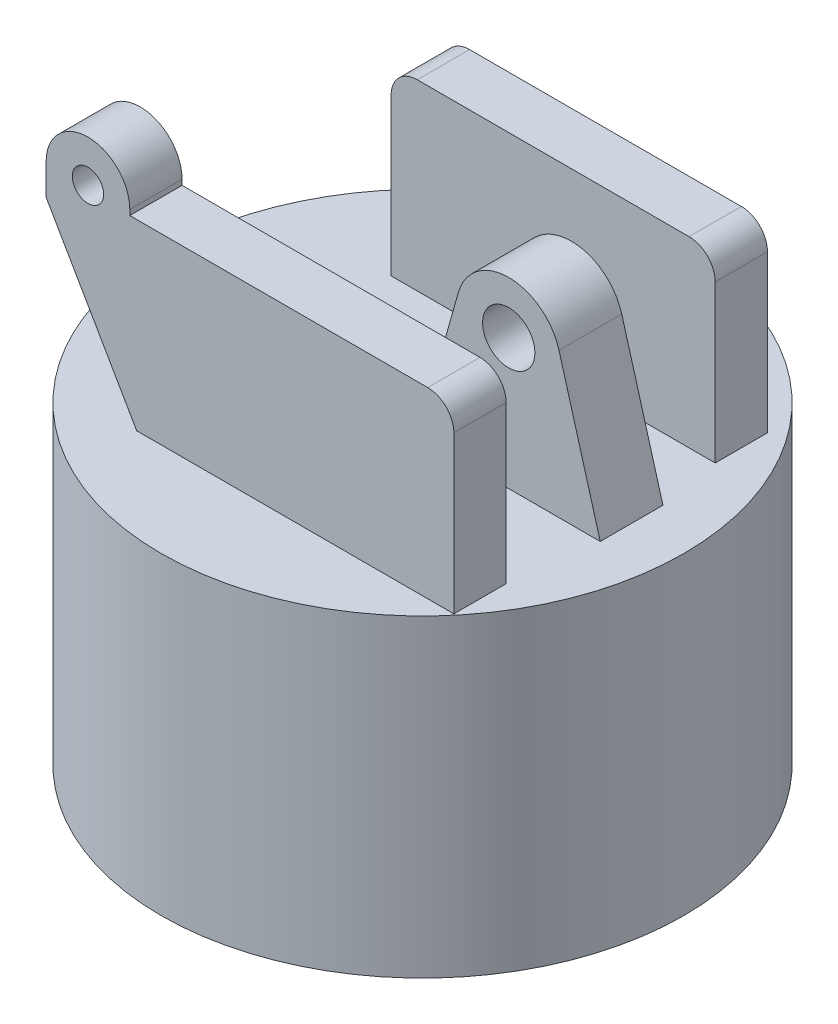
ISO-10303-21;
HEADER;
FILE_DESCRIPTION(('STEP AP214'),'2;1');
FILE_NAME('part.step','',(''),(''),'','','');
FILE_SCHEMA(('AUTOMOTIVE_DESIGN { 1 0 10303 214 1 1 1 1 }'));
ENDSEC;
DATA;
#1=APPLICATION_CONTEXT('core data for automotive mechanical design processes');
#2=APPLICATION_PROTOCOL_DEFINITION('international standard','automotive_design',2000,#1);
#3=PRODUCT_CONTEXT('',#1,'mechanical');
#4=PRODUCT('Part','Part','',(#3));
#5=PRODUCT_RELATED_PRODUCT_CATEGORY('part','',(#4));
#6=PRODUCT_DEFINITION_FORMATION('','',#4);
#7=PRODUCT_DEFINITION_CONTEXT('part definition',#1,'design');
#8=PRODUCT_DEFINITION('design','',#6,#7);
#9=PRODUCT_DEFINITION_SHAPE('','',#8);
#10=(LENGTH_UNIT() NAMED_UNIT(*) SI_UNIT(.MILLI.,.METRE.));
#11=(NAMED_UNIT(*) PLANE_ANGLE_UNIT() SI_UNIT($,.RADIAN.));
#12=(NAMED_UNIT(*) SI_UNIT($,.STERADIAN.) SOLID_ANGLE_UNIT());
#13=UNCERTAINTY_MEASURE_WITH_UNIT(LENGTH_MEASURE(1.E-05),#10,'distance_accuracy_value','');
#14=(GEOMETRIC_REPRESENTATION_CONTEXT(3) GLOBAL_UNCERTAINTY_ASSIGNED_CONTEXT((#13)) GLOBAL_UNIT_ASSIGNED_CONTEXT((#10,
#11,#12)) REPRESENTATION_CONTEXT('',''));
#15=CARTESIAN_POINT('',(0.,0.,0.));
#16=DIRECTION('',(0.,0.,1.));
#17=DIRECTION('',(1.,0.,0.));
#18=AXIS2_PLACEMENT_3D('',#15,#16,#17);
#19=CARTESIAN_POINT('',(0.,60.,0.));
#20=DIRECTION('',(0.,1.,0.));
#21=DIRECTION('',(0.,0.,1.));
#22=AXIS2_PLACEMENT_3D('',#19,#20,#21);
#23=PLANE('',#22);
#24=DIRECTION('',(1.,0.,0.));
#25=VECTOR('',#24,1.);
#26=CARTESIAN_POINT('',(38.,60.,-28.));
#27=LINE('',#26,#25);
#28=CARTESIAN_POINT('',(-24.,60.,-28.));
#29=VERTEX_POINT('',#28);
#30=CARTESIAN_POINT('',(38.,60.,-28.));
#31=VERTEX_POINT('',#30);
#32=EDGE_CURVE('E206',#29,#31,#27,.T.);
#33=ORIENTED_EDGE('',*,*,#32,.T.);
#34=DIRECTION('',(0.,0.,1.));
#35=VECTOR('',#34,1.);
#36=CARTESIAN_POINT('',(38.,60.,-28.));
#37=LINE('',#36,#35);
#38=CARTESIAN_POINT('',(38.,60.,-18.));
#39=VERTEX_POINT('',#38);
#40=EDGE_CURVE('E216',#31,#39,#37,.T.);
#41=ORIENTED_EDGE('',*,*,#40,.T.);
#42=DIRECTION('',(1.,0.,0.));
#43=VECTOR('',#42,1.);
#44=CARTESIAN_POINT('',(38.,60.,-18.));
#45=LINE('',#44,#43);
#46=CARTESIAN_POINT('',(-24.,60.,-18.));
#47=VERTEX_POINT('',#46);
#48=EDGE_CURVE('E201',#47,#39,#45,.T.);
#49=ORIENTED_EDGE('',*,*,#48,.F.);
#50=DIRECTION('',(0.,0.,1.));
#51=VECTOR('',#50,1.);
#52=CARTESIAN_POINT('',(-24.,60.,-28.));
#53=LINE('',#52,#51);
#54=EDGE_CURVE('E208',#29,#47,#53,.T.);
#55=ORIENTED_EDGE('',*,*,#54,.F.);
#56=EDGE_LOOP('',(#33,#41,#49,#55));
#57=FACE_BOUND('',#56,.T.);
#58=CARTESIAN_POINT('',(0.,60.,0.));
#59=DIRECTION('',(0.,1.,0.));
#60=DIRECTION('',(0.,0.,1.));
#61=AXIS2_PLACEMENT_3D('',#58,#59,#60);
#62=CIRCLE('',#61,50.);
#63=CARTESIAN_POINT('',(0.,60.,-50.));
#64=VERTEX_POINT('',#63);
#65=EDGE_CURVE('E277',#64,#64,#62,.T.);
#66=ORIENTED_EDGE('',*,*,#65,.T.);
#67=EDGE_LOOP('',(#66));
#68=FACE_BOUND('',#67,.T.);
#69=DIRECTION('',(1.,0.,0.));
#70=VECTOR('',#69,1.);
#71=CARTESIAN_POINT('',(-22.6794919243112,60.,22.));
#72=LINE('',#71,#70);
#73=CARTESIAN_POINT('',(-22.6794919243112,60.,22.));
#74=VERTEX_POINT('',#73);
#75=CARTESIAN_POINT('',(38.,60.,22.));
#76=VERTEX_POINT('',#75);
#77=EDGE_CURVE('E225',#74,#76,#72,.T.);
#78=ORIENTED_EDGE('',*,*,#77,.T.);
#79=DIRECTION('',(0.,0.,-1.));
#80=VECTOR('',#79,1.);
#81=CARTESIAN_POINT('',(38.,60.,32.));
#82=LINE('',#81,#80);
#83=CARTESIAN_POINT('',(38.,60.,32.));
#84=VERTEX_POINT('',#83);
#85=EDGE_CURVE('E273',#84,#76,#82,.T.);
#86=ORIENTED_EDGE('',*,*,#85,.F.);
#87=DIRECTION('',(1.,0.,0.));
#88=VECTOR('',#87,1.);
#89=CARTESIAN_POINT('',(-22.6794919243112,60.,32.));
#90=LINE('',#89,#88);
#91=CARTESIAN_POINT('',(-22.6794919243112,60.,32.));
#92=VERTEX_POINT('',#91);
#93=EDGE_CURVE('E228',#92,#84,#90,.T.);
#94=ORIENTED_EDGE('',*,*,#93,.F.);
#95=DIRECTION('',(0.,0.,-1.));
#96=VECTOR('',#95,1.);
#97=CARTESIAN_POINT('',(-22.6794919243112,60.,32.));
#98=LINE('',#97,#96);
#99=EDGE_CURVE('E244',#92,#74,#98,.T.);
#100=ORIENTED_EDGE('',*,*,#99,.T.);
#101=EDGE_LOOP('',(#78,#86,#94,#100));
#102=FACE_BOUND('',#101,.T.);
#103=DIRECTION('',(1.,0.,0.));
#104=VECTOR('',#103,1.);
#105=CARTESIAN_POINT('',(4.99999999999999,60.,6.));
#106=LINE('',#105,#104);
#107=CARTESIAN_POINT('',(4.99999999999999,60.,6.));
#108=VERTEX_POINT('',#107);
#109=CARTESIAN_POINT('',(40.,60.,6.));
#110=VERTEX_POINT('',#109);
#111=EDGE_CURVE('E175',#108,#110,#106,.T.);
#112=ORIENTED_EDGE('',*,*,#111,.F.);
#113=DIRECTION('',(0.,0.,-1.));
#114=VECTOR('',#113,1.);
#115=CARTESIAN_POINT('',(4.99999999999999,60.,6.));
#116=LINE('',#115,#114);
#117=CARTESIAN_POINT('',(4.99999999999999,60.,-6.));
#118=VERTEX_POINT('',#117);
#119=EDGE_CURVE('E172',#108,#118,#116,.T.);
#120=ORIENTED_EDGE('',*,*,#119,.T.);
#121=DIRECTION('',(1.,0.,0.));
#122=VECTOR('',#121,1.);
#123=CARTESIAN_POINT('',(4.99999999999999,60.,-6.));
#124=LINE('',#123,#122);
#125=CARTESIAN_POINT('',(40.,60.,-6.));
#126=VERTEX_POINT('',#125);
#127=EDGE_CURVE('E357',#118,#126,#124,.T.);
#128=ORIENTED_EDGE('',*,*,#127,.T.);
#129=DIRECTION('',(0.,0.,-1.));
#130=VECTOR('',#129,1.);
#131=CARTESIAN_POINT('',(40.,60.,6.));
#132=LINE('',#131,#130);
#133=EDGE_CURVE('E193',#110,#126,#132,.T.);
#134=ORIENTED_EDGE('',*,*,#133,.F.);
#135=EDGE_LOOP('',(#112,#120,#128,#134));
#136=FACE_BOUND('',#135,.T.);
#137=ADVANCED_FACE('F41',(#57,#68,#102,#136),#23,.T.);
#138=CARTESIAN_POINT('',(0.,60.,0.));
#139=DIRECTION('',(0.,-1.,0.));
#140=DIRECTION('',(0.,0.,-1.));
#141=AXIS2_PLACEMENT_3D('',#138,#139,#140);
#142=CYLINDRICAL_SURFACE('',#141,50.);
#143=CARTESIAN_POINT('',(0.,0.,0.));
#144=DIRECTION('',(0.,1.,0.));
#145=DIRECTION('',(0.,0.,1.));
#146=AXIS2_PLACEMENT_3D('',#143,#144,#145);
#147=CIRCLE('',#146,50.);
#148=CARTESIAN_POINT('',(0.,0.,-50.));
#149=VERTEX_POINT('',#148);
#150=EDGE_CURVE('E276',#149,#149,#147,.T.);
#151=CARTESIAN_POINT('',(0.,60.,-50.));
#152=CARTESIAN_POINT('',(0.,59.375,-50.));
#153=CARTESIAN_POINT('',(0.,58.75,-50.));
#154=CARTESIAN_POINT('',(0.,57.5,-50.));
#155=CARTESIAN_POINT('',(0.,56.875,-50.));
#156=CARTESIAN_POINT('',(0.,55.625,-50.));
#157=CARTESIAN_POINT('',(0.,55.,-50.));
#158=CARTESIAN_POINT('',(0.,53.75,-50.));
#159=CARTESIAN_POINT('',(0.,53.125,-50.));
#160=CARTESIAN_POINT('',(0.,51.875,-50.));
#161=CARTESIAN_POINT('',(0.,51.25,-50.));
#162=CARTESIAN_POINT('',(0.,50.,-50.));
#163=CARTESIAN_POINT('',(0.,49.375,-50.));
#164=CARTESIAN_POINT('',(0.,48.125,-50.));
#165=CARTESIAN_POINT('',(0.,47.5,-50.));
#166=CARTESIAN_POINT('',(0.,46.25,-50.));
#167=CARTESIAN_POINT('',(0.,45.625,-50.));
#168=CARTESIAN_POINT('',(0.,44.375,-50.));
#169=CARTESIAN_POINT('',(0.,43.75,-50.));
#170=CARTESIAN_POINT('',(0.,42.5,-50.));
#171=CARTESIAN_POINT('',(0.,41.875,-50.));
#172=CARTESIAN_POINT('',(0.,40.625,-50.));
#173=CARTESIAN_POINT('',(0.,40.,-50.));
#174=CARTESIAN_POINT('',(0.,38.75,-50.));
#175=CARTESIAN_POINT('',(0.,38.125,-50.));
#176=CARTESIAN_POINT('',(0.,36.875,-50.));
#177=CARTESIAN_POINT('',(0.,36.25,-50.));
#178=CARTESIAN_POINT('',(0.,35.,-50.));
#179=CARTESIAN_POINT('',(0.,34.375,-50.));
#180=CARTESIAN_POINT('',(0.,33.125,-50.));
#181=CARTESIAN_POINT('',(0.,32.5,-50.));
#182=CARTESIAN_POINT('',(0.,31.25,-50.));
#183=CARTESIAN_POINT('',(0.,30.625,-50.));
#184=CARTESIAN_POINT('',(0.,29.375,-50.));
#185=CARTESIAN_POINT('',(0.,28.75,-50.));
#186=CARTESIAN_POINT('',(0.,27.5,-50.));
#187=CARTESIAN_POINT('',(0.,26.875,-50.));
#188=CARTESIAN_POINT('',(0.,25.625,-50.));
#189=CARTESIAN_POINT('',(0.,25.,-50.));
#190=CARTESIAN_POINT('',(0.,23.75,-50.));
#191=CARTESIAN_POINT('',(0.,23.125,-50.));
#192=CARTESIAN_POINT('',(0.,21.875,-50.));
#193=CARTESIAN_POINT('',(0.,21.25,-50.));
#194=CARTESIAN_POINT('',(0.,20.,-50.));
#195=CARTESIAN_POINT('',(0.,19.375,-50.));
#196=CARTESIAN_POINT('',(0.,18.125,-50.));
#197=CARTESIAN_POINT('',(0.,17.5,-50.));
#198=CARTESIAN_POINT('',(0.,16.25,-50.));
#199=CARTESIAN_POINT('',(0.,15.625,-50.));
#200=CARTESIAN_POINT('',(0.,14.375,-50.));
#201=CARTESIAN_POINT('',(0.,13.75,-50.));
#202=CARTESIAN_POINT('',(0.,12.5,-50.));
#203=CARTESIAN_POINT('',(0.,11.875,-50.));
#204=CARTESIAN_POINT('',(0.,10.625,-50.));
#205=CARTESIAN_POINT('',(0.,10.,-50.));
#206=CARTESIAN_POINT('',(0.,8.75,-50.));
#207=CARTESIAN_POINT('',(0.,8.125,-50.));
#208=CARTESIAN_POINT('',(0.,6.875,-50.));
#209=CARTESIAN_POINT('',(0.,6.25,-50.));
#210=CARTESIAN_POINT('',(0.,5.,-50.));
#211=CARTESIAN_POINT('',(0.,4.375,-50.));
#212=CARTESIAN_POINT('',(0.,3.125,-50.));
#213=CARTESIAN_POINT('',(0.,2.5,-50.));
#214=CARTESIAN_POINT('',(0.,1.25,-50.));
#215=CARTESIAN_POINT('',(0.,0.625000000000001,-50.));
#216=CARTESIAN_POINT('',(0.,0.,-50.));
#217=B_SPLINE_CURVE_WITH_KNOTS('',3,(#151,#152,#153,#154,#155,#156,#157,#158,#159,#160,#161,
#162,#163,#164,#165,#166,#167,#168,#169,#170,#171,#172,#173,#174,#175,#176,#177,#178,#179,#180,
#181,#182,#183,#184,#185,#186,#187,#188,#189,#190,#191,#192,#193,#194,#195,#196,#197,#198,#199,
#200,#201,#202,#203,#204,#205,#206,#207,#208,#209,#210,#211,#212,#213,#214,#215,#216),
.UNSPECIFIED.,.F.,.F.,(4,2,2,2,2,2,2,2,2,2,2,2,2,2,2,2,2,2,2,2,2,2,2,2,2,2,2,2,2,2,2,2,4),(0.,
1.875,3.75,5.62500000000001,7.50000000000001,9.375,11.25,13.125,15.,16.875,18.75,20.625,22.5,
24.375,26.25,28.125,30.,31.875,33.75,35.625,37.5,39.375,41.25,43.125,45.,46.875,48.75,50.625,
52.5,54.375,56.25,58.125,60.),.UNSPECIFIED.);
#218=EDGE_CURVE('BSEAM344',#64,#149,#217,.T.);
#219=ORIENTED_EDGE('',*,*,#65,.F.);
#220=ORIENTED_EDGE('',*,*,#150,.T.);
#221=ORIENTED_EDGE('',*,*,#218,.T.);
#222=ORIENTED_EDGE('',*,*,#218,.F.);
#223=EDGE_LOOP('',(#219,#221,#220,#222));
#224=FACE_BOUND('',#223,.T.);
#225=ADVANCED_FACE('F344',(#224),#142,.T.);
#226=CARTESIAN_POINT('',(0.,0.,0.));
#227=DIRECTION('',(0.,1.,0.));
#228=DIRECTION('',(0.,0.,1.));
#229=AXIS2_PLACEMENT_3D('',#226,#227,#228);
#230=PLANE('',#229);
#231=ORIENTED_EDGE('',*,*,#150,.F.);
#232=EDGE_LOOP('',(#231));
#233=FACE_BOUND('',#232,.T.);
#234=ADVANCED_FACE('F419',(#233),#230,.F.);
#235=CARTESIAN_POINT('',(-32.,96.,32.));
#236=DIRECTION('',(0.,0.,1.));
#237=DIRECTION('',(1.,0.,0.));
#238=AXIS2_PLACEMENT_3D('',#235,#236,#237);
#239=PLANE('',#238);
#240=DIRECTION('',(0.,1.,0.));
#241=VECTOR('',#240,1.);
#242=CARTESIAN_POINT('',(38.,60.,32.));
#243=LINE('',#242,#241);
#244=CARTESIAN_POINT('',(38.,90.,32.));
#245=VERTEX_POINT('',#244);
#246=EDGE_CURVE('E231',#84,#245,#243,.T.);
#247=ORIENTED_EDGE('',*,*,#246,.T.);
#248=CARTESIAN_POINT('',(33.,90.,32.));
#249=DIRECTION('',(0.,0.,1.));
#250=DIRECTION('',(1.,0.,0.));
#251=AXIS2_PLACEMENT_3D('',#248,#249,#250);
#252=CIRCLE('',#251,5.);
#253=CARTESIAN_POINT('',(33.,95.,32.));
#254=VERTEX_POINT('',#253);
#255=EDGE_CURVE('E11',#245,#254,#252,.T.);
#256=ORIENTED_EDGE('',*,*,#255,.T.);
#257=DIRECTION('',(-1.,0.,0.));
#258=VECTOR('',#257,1.);
#259=CARTESIAN_POINT('',(38.,95.,32.));
#260=LINE('',#259,#258);
#261=CARTESIAN_POINT('',(-24.,95.,32.));
#262=VERTEX_POINT('',#261);
#263=EDGE_CURVE('E234',#254,#262,#260,.T.);
#264=ORIENTED_EDGE('',*,*,#263,.T.);
#265=DIRECTION('',(0.,1.,0.));
#266=VECTOR('',#265,1.);
#267=CARTESIAN_POINT('',(-24.,95.,32.));
#268=LINE('',#267,#266);
#269=CARTESIAN_POINT('',(-24.,96.,32.));
#270=VERTEX_POINT('',#269);
#271=EDGE_CURVE('E236',#262,#270,#268,.T.);
#272=ORIENTED_EDGE('',*,*,#271,.T.);
#273=CARTESIAN_POINT('',(-32.,96.,32.));
#274=DIRECTION('',(0.,0.,1.));
#275=DIRECTION('',(1.,0.,0.));
#276=AXIS2_PLACEMENT_3D('',#273,#274,#275);
#277=CIRCLE('',#276,8.);
#278=CARTESIAN_POINT('',(-40.,96.,32.));
#279=VERTEX_POINT('',#278);
#280=EDGE_CURVE('E238',#270,#279,#277,.T.);
#281=ORIENTED_EDGE('',*,*,#280,.T.);
#282=DIRECTION('',(0.,-1.,0.));
#283=VECTOR('',#282,1.);
#284=CARTESIAN_POINT('',(-40.,96.,32.));
#285=LINE('',#284,#283);
#286=CARTESIAN_POINT('',(-40.,90.,32.));
#287=VERTEX_POINT('',#286);
#288=EDGE_CURVE('E240',#279,#287,#285,.T.);
#289=ORIENTED_EDGE('',*,*,#288,.T.);
#290=DIRECTION('',(0.500000000000002,-0.866025403784437,0.));
#291=VECTOR('',#290,1.);
#292=CARTESIAN_POINT('',(-40.,90.,32.));
#293=LINE('',#292,#291);
#294=EDGE_CURVE('E242',#287,#92,#293,.T.);
#295=ORIENTED_EDGE('',*,*,#294,.T.);
#296=ORIENTED_EDGE('',*,*,#93,.T.);
#297=EDGE_LOOP('',(#247,#256,#264,#272,#281,#289,#295,#296));
#298=FACE_BOUND('',#297,.T.);
#299=CARTESIAN_POINT('',(-32.,96.,32.));
#300=DIRECTION('',(0.,0.,1.));
#301=DIRECTION('',(1.,0.,0.));
#302=AXIS2_PLACEMENT_3D('',#299,#300,#301);
#303=CIRCLE('',#302,3.);
#304=CARTESIAN_POINT('',(-29.,96.,32.));
#305=VERTEX_POINT('',#304);
#306=EDGE_CURVE('E222',#305,#305,#303,.T.);
#307=ORIENTED_EDGE('',*,*,#306,.F.);
#308=EDGE_LOOP('',(#307));
#309=FACE_BOUND('',#308,.T.);
#310=ADVANCED_FACE('F316',(#298,#309),#239,.T.);
#311=CARTESIAN_POINT('',(-32.,96.,22.));
#312=DIRECTION('',(0.,0.,1.));
#313=DIRECTION('',(1.,0.,0.));
#314=AXIS2_PLACEMENT_3D('',#311,#312,#313);
#315=PLANE('',#314);
#316=DIRECTION('',(-1.,0.,0.));
#317=VECTOR('',#316,1.);
#318=CARTESIAN_POINT('',(38.,95.,22.));
#319=LINE('',#318,#317);
#320=CARTESIAN_POINT('',(33.,95.,22.));
#321=VERTEX_POINT('',#320);
#322=CARTESIAN_POINT('',(-24.,95.,22.));
#323=VERTEX_POINT('',#322);
#324=EDGE_CURVE('E249',#321,#323,#319,.T.);
#325=ORIENTED_EDGE('',*,*,#324,.F.);
#326=CARTESIAN_POINT('',(33.,90.,22.));
#327=DIRECTION('',(0.,0.,1.));
#328=DIRECTION('',(1.,0.,0.));
#329=AXIS2_PLACEMENT_3D('',#326,#327,#328);
#330=CIRCLE('',#329,5.);
#331=CARTESIAN_POINT('',(38.,90.,22.));
#332=VERTEX_POINT('',#331);
#333=EDGE_CURVE('E303',#321,#332,#330,.F.);
#334=ORIENTED_EDGE('',*,*,#333,.T.);
#335=DIRECTION('',(0.,1.,0.));
#336=VECTOR('',#335,1.);
#337=CARTESIAN_POINT('',(38.,60.,22.));
#338=LINE('',#337,#336);
#339=EDGE_CURVE('E247',#76,#332,#338,.T.);
#340=ORIENTED_EDGE('',*,*,#339,.F.);
#341=ORIENTED_EDGE('',*,*,#77,.F.);
#342=DIRECTION('',(0.500000000000002,-0.866025403784437,0.));
#343=VECTOR('',#342,1.);
#344=CARTESIAN_POINT('',(-40.,90.,22.));
#345=LINE('',#344,#343);
#346=CARTESIAN_POINT('',(-40.,90.,22.));
#347=VERTEX_POINT('',#346);
#348=EDGE_CURVE('E232',#347,#74,#345,.T.);
#349=ORIENTED_EDGE('',*,*,#348,.F.);
#350=DIRECTION('',(0.,-1.,0.));
#351=VECTOR('',#350,1.);
#352=CARTESIAN_POINT('',(-40.,96.,22.));
#353=LINE('',#352,#351);
#354=CARTESIAN_POINT('',(-40.,96.,22.));
#355=VERTEX_POINT('',#354);
#356=EDGE_CURVE('E255',#355,#347,#353,.T.);
#357=ORIENTED_EDGE('',*,*,#356,.F.);
#358=CARTESIAN_POINT('',(-32.,96.,22.));
#359=DIRECTION('',(0.,0.,1.));
#360=DIRECTION('',(1.,0.,0.));
#361=AXIS2_PLACEMENT_3D('',#358,#359,#360);
#362=CIRCLE('',#361,8.);
#363=CARTESIAN_POINT('',(-24.,96.,22.));
#364=VERTEX_POINT('',#363);
#365=EDGE_CURVE('E253',#364,#355,#362,.T.);
#366=ORIENTED_EDGE('',*,*,#365,.F.);
#367=DIRECTION('',(0.,1.,0.));
#368=VECTOR('',#367,1.);
#369=CARTESIAN_POINT('',(-24.,95.,22.));
#370=LINE('',#369,#368);
#371=EDGE_CURVE('E251',#323,#364,#370,.T.);
#372=ORIENTED_EDGE('',*,*,#371,.F.);
#373=EDGE_LOOP('',(#325,#334,#340,#341,#349,#357,#366,#372));
#374=FACE_BOUND('',#373,.T.);
#375=CARTESIAN_POINT('',(-32.,96.,22.));
#376=DIRECTION('',(0.,0.,1.));
#377=DIRECTION('',(1.,0.,0.));
#378=AXIS2_PLACEMENT_3D('',#375,#376,#377);
#379=CIRCLE('',#378,3.);
#380=CARTESIAN_POINT('',(-29.,96.,22.));
#381=VERTEX_POINT('',#380);
#382=EDGE_CURVE('E219',#381,#381,#379,.T.);
#383=ORIENTED_EDGE('',*,*,#382,.T.);
#384=EDGE_LOOP('',(#383));
#385=FACE_BOUND('',#384,.T.);
#386=ADVANCED_FACE('F306',(#374,#385),#315,.F.);
#387=CARTESIAN_POINT('',(38.,60.,32.));
#388=DIRECTION('',(-1.,0.,0.));
#389=DIRECTION('',(0.,-1.,0.));
#390=AXIS2_PLACEMENT_3D('',#387,#388,#389);
#391=PLANE('',#390);
#392=ORIENTED_EDGE('',*,*,#339,.T.);
#393=DIRECTION('',(0.,0.,-1.));
#394=VECTOR('',#393,1.);
#395=CARTESIAN_POINT('',(38.,90.,32.));
#396=LINE('',#395,#394);
#397=EDGE_CURVE('E49',#332,#245,#396,.F.);
#398=ORIENTED_EDGE('',*,*,#397,.T.);
#399=ORIENTED_EDGE('',*,*,#246,.F.);
#400=ORIENTED_EDGE('',*,*,#85,.T.);
#401=EDGE_LOOP('',(#392,#398,#399,#400));
#402=FACE_BOUND('',#401,.T.);
#403=ADVANCED_FACE('F311',(#402),#391,.F.);
#404=CARTESIAN_POINT('',(38.,95.,32.));
#405=DIRECTION('',(0.,-1.,0.));
#406=DIRECTION('',(1.,0.,0.));
#407=AXIS2_PLACEMENT_3D('',#404,#405,#406);
#408=PLANE('',#407);
#409=ORIENTED_EDGE('',*,*,#263,.F.);
#410=DIRECTION('',(0.,0.,-1.));
#411=VECTOR('',#410,1.);
#412=CARTESIAN_POINT('',(33.,95.,32.));
#413=LINE('',#412,#411);
#414=EDGE_CURVE('E300',#254,#321,#413,.T.);
#415=ORIENTED_EDGE('',*,*,#414,.T.);
#416=ORIENTED_EDGE('',*,*,#324,.T.);
#417=DIRECTION('',(0.,0.,-1.));
#418=VECTOR('',#417,1.);
#419=CARTESIAN_POINT('',(-24.,95.,32.));
#420=LINE('',#419,#418);
#421=EDGE_CURVE('E270',#262,#323,#420,.T.);
#422=ORIENTED_EDGE('',*,*,#421,.F.);
#423=EDGE_LOOP('',(#409,#415,#416,#422));
#424=FACE_BOUND('',#423,.T.);
#425=ADVANCED_FACE('F320',(#424),#408,.F.);
#426=CARTESIAN_POINT('',(-24.,95.,32.));
#427=DIRECTION('',(-1.,0.,0.));
#428=DIRECTION('',(0.,0.,1.));
#429=AXIS2_PLACEMENT_3D('',#426,#427,#428);
#430=PLANE('',#429);
#431=ORIENTED_EDGE('',*,*,#371,.T.);
#432=DIRECTION('',(0.,0.,-1.));
#433=VECTOR('',#432,1.);
#434=CARTESIAN_POINT('',(-24.,96.,32.));
#435=LINE('',#434,#433);
#436=EDGE_CURVE('E267',#270,#364,#435,.T.);
#437=ORIENTED_EDGE('',*,*,#436,.F.);
#438=ORIENTED_EDGE('',*,*,#271,.F.);
#439=ORIENTED_EDGE('',*,*,#421,.T.);
#440=EDGE_LOOP('',(#431,#437,#438,#439));
#441=FACE_BOUND('',#440,.T.);
#442=ADVANCED_FACE('F324',(#441),#430,.F.);
#443=CARTESIAN_POINT('',(-32.,96.,32.));
#444=DIRECTION('',(0.,0.,-1.));
#445=DIRECTION('',(-1.,0.,0.));
#446=AXIS2_PLACEMENT_3D('',#443,#444,#445);
#447=CYLINDRICAL_SURFACE('',#446,8.);
#448=ORIENTED_EDGE('',*,*,#365,.T.);
#449=DIRECTION('',(0.,0.,-1.));
#450=VECTOR('',#449,1.);
#451=CARTESIAN_POINT('',(-40.,96.,32.));
#452=LINE('',#451,#450);
#453=EDGE_CURVE('E264',#279,#355,#452,.T.);
#454=ORIENTED_EDGE('',*,*,#453,.F.);
#455=ORIENTED_EDGE('',*,*,#280,.F.);
#456=ORIENTED_EDGE('',*,*,#436,.T.);
#457=EDGE_LOOP('',(#448,#454,#455,#456));
#458=FACE_BOUND('',#457,.T.);
#459=ADVANCED_FACE('F330',(#458),#447,.T.);
#460=CARTESIAN_POINT('',(-40.,96.,32.));
#461=DIRECTION('',(1.,0.,0.));
#462=DIRECTION('',(0.,0.,-1.));
#463=AXIS2_PLACEMENT_3D('',#460,#461,#462);
#464=PLANE('',#463);
#465=ORIENTED_EDGE('',*,*,#356,.T.);
#466=DIRECTION('',(0.,0.,-1.));
#467=VECTOR('',#466,1.);
#468=CARTESIAN_POINT('',(-40.,90.,32.));
#469=LINE('',#468,#467);
#470=EDGE_CURVE('E261',#287,#347,#469,.T.);
#471=ORIENTED_EDGE('',*,*,#470,.F.);
#472=ORIENTED_EDGE('',*,*,#288,.F.);
#473=ORIENTED_EDGE('',*,*,#453,.T.);
#474=EDGE_LOOP('',(#465,#471,#472,#473));
#475=FACE_BOUND('',#474,.T.);
#476=ADVANCED_FACE('F334',(#475),#464,.F.);
#477=CARTESIAN_POINT('',(-40.,90.,32.));
#478=DIRECTION('',(0.866025403784438,0.500000000000002,0.));
#479=DIRECTION('',(-0.500000000000002,0.866025403784438,0.));
#480=AXIS2_PLACEMENT_3D('',#477,#478,#479);
#481=PLANE('',#480);
#482=ORIENTED_EDGE('',*,*,#348,.T.);
#483=ORIENTED_EDGE('',*,*,#99,.F.);
#484=ORIENTED_EDGE('',*,*,#294,.F.);
#485=ORIENTED_EDGE('',*,*,#470,.T.);
#486=EDGE_LOOP('',(#482,#483,#484,#485));
#487=FACE_BOUND('',#486,.T.);
#488=ADVANCED_FACE('F339',(#487),#481,.F.);
#489=CARTESIAN_POINT('',(-32.,96.,32.));
#490=DIRECTION('',(0.,0.,-1.));
#491=DIRECTION('',(-1.,0.,0.));
#492=AXIS2_PLACEMENT_3D('',#489,#490,#491);
#493=CYLINDRICAL_SURFACE('',#492,3.);
#494=ORIENTED_EDGE('',*,*,#306,.T.);
#495=EDGE_LOOP('',(#494));
#496=FACE_BOUND('',#495,.T.);
#497=ORIENTED_EDGE('',*,*,#382,.F.);
#498=EDGE_LOOP('',(#497));
#499=FACE_BOUND('',#498,.T.);
#500=ADVANCED_FACE('F412',(#496,#499),#493,.F.);
#501=CARTESIAN_POINT('',(38.,95.,-28.));
#502=DIRECTION('',(1.,0.,0.));
#503=DIRECTION('',(0.,1.,0.));
#504=AXIS2_PLACEMENT_3D('',#501,#502,#503);
#505=PLANE('',#504);
#506=DIRECTION('',(0.,1.,0.));
#507=VECTOR('',#506,1.);
#508=CARTESIAN_POINT('',(38.,95.,-28.));
#509=LINE('',#508,#507);
#510=CARTESIAN_POINT('',(38.,90.,-28.));
#511=VERTEX_POINT('',#510);
#512=EDGE_CURVE('E197',#31,#511,#509,.T.);
#513=ORIENTED_EDGE('',*,*,#512,.T.);
#514=DIRECTION('',(0.,0.,1.));
#515=VECTOR('',#514,1.);
#516=CARTESIAN_POINT('',(38.,90.,-28.));
#517=LINE('',#516,#515);
#518=CARTESIAN_POINT('',(38.,90.,-18.));
#519=VERTEX_POINT('',#518);
#520=EDGE_CURVE('E297',#511,#519,#517,.T.);
#521=ORIENTED_EDGE('',*,*,#520,.T.);
#522=DIRECTION('',(0.,1.,0.));
#523=VECTOR('',#522,1.);
#524=CARTESIAN_POINT('',(38.,95.,-18.));
#525=LINE('',#524,#523);
#526=EDGE_CURVE('E188',#39,#519,#525,.T.);
#527=ORIENTED_EDGE('',*,*,#526,.F.);
#528=ORIENTED_EDGE('',*,*,#40,.F.);
#529=EDGE_LOOP('',(#513,#521,#527,#528));
#530=FACE_BOUND('',#529,.T.);
#531=ADVANCED_FACE('F405',(#530),#505,.T.);
#532=CARTESIAN_POINT('',(-24.,95.,-28.));
#533=DIRECTION('',(-1.,0.,0.));
#534=DIRECTION('',(0.,-1.,0.));
#535=AXIS2_PLACEMENT_3D('',#532,#533,#534);
#536=PLANE('',#535);
#537=DIRECTION('',(0.,-1.,0.));
#538=VECTOR('',#537,1.);
#539=CARTESIAN_POINT('',(-24.,95.,-18.));
#540=LINE('',#539,#538);
#541=CARTESIAN_POINT('',(-24.,90.,-18.));
#542=VERTEX_POINT('',#541);
#543=EDGE_CURVE('E212',#542,#47,#540,.T.);
#544=ORIENTED_EDGE('',*,*,#543,.F.);
#545=DIRECTION('',(0.,0.,1.));
#546=VECTOR('',#545,1.);
#547=CARTESIAN_POINT('',(-24.,90.,-28.));
#548=LINE('',#547,#546);
#549=CARTESIAN_POINT('',(-24.,90.,-28.));
#550=VERTEX_POINT('',#549);
#551=EDGE_CURVE('E291',#542,#550,#548,.F.);
#552=ORIENTED_EDGE('',*,*,#551,.T.);
#553=DIRECTION('',(0.,-1.,0.));
#554=VECTOR('',#553,1.);
#555=CARTESIAN_POINT('',(-24.,95.,-28.));
#556=LINE('',#555,#554);
#557=EDGE_CURVE('E204',#550,#29,#556,.T.);
#558=ORIENTED_EDGE('',*,*,#557,.T.);
#559=ORIENTED_EDGE('',*,*,#54,.T.);
#560=EDGE_LOOP('',(#544,#552,#558,#559));
#561=FACE_BOUND('',#560,.T.);
#562=ADVANCED_FACE('F402',(#561),#536,.T.);
#563=CARTESIAN_POINT('',(38.,95.,-28.));
#564=DIRECTION('',(0.,1.,0.));
#565=DIRECTION('',(-1.,0.,0.));
#566=AXIS2_PLACEMENT_3D('',#563,#564,#565);
#567=PLANE('',#566);
#568=DIRECTION('',(-1.,0.,0.));
#569=VECTOR('',#568,1.);
#570=CARTESIAN_POINT('',(38.,95.,-28.));
#571=LINE('',#570,#569);
#572=CARTESIAN_POINT('',(33.,95.,-28.));
#573=VERTEX_POINT('',#572);
#574=CARTESIAN_POINT('',(-19.,95.,-28.));
#575=VERTEX_POINT('',#574);
#576=EDGE_CURVE('E200',#573,#575,#571,.T.);
#577=ORIENTED_EDGE('',*,*,#576,.T.);
#578=DIRECTION('',(0.,0.,1.));
#579=VECTOR('',#578,1.);
#580=CARTESIAN_POINT('',(-19.,95.,-28.));
#581=LINE('',#580,#579);
#582=CARTESIAN_POINT('',(-19.,95.,-18.));
#583=VERTEX_POINT('',#582);
#584=EDGE_CURVE('E284',#575,#583,#581,.T.);
#585=ORIENTED_EDGE('',*,*,#584,.T.);
#586=DIRECTION('',(-1.,0.,0.));
#587=VECTOR('',#586,1.);
#588=CARTESIAN_POINT('',(38.,95.,-18.));
#589=LINE('',#588,#587);
#590=CARTESIAN_POINT('',(33.,95.,-18.));
#591=VERTEX_POINT('',#590);
#592=EDGE_CURVE('E191',#591,#583,#589,.T.);
#593=ORIENTED_EDGE('',*,*,#592,.F.);
#594=DIRECTION('',(0.,0.,1.));
#595=VECTOR('',#594,1.);
#596=CARTESIAN_POINT('',(33.,95.,-28.));
#597=LINE('',#596,#595);
#598=EDGE_CURVE('E280',#591,#573,#597,.F.);
#599=ORIENTED_EDGE('',*,*,#598,.T.);
#600=EDGE_LOOP('',(#577,#585,#593,#599));
#601=FACE_BOUND('',#600,.T.);
#602=ADVANCED_FACE('F396',(#601),#567,.T.);
#603=CARTESIAN_POINT('',(0.,0.,-28.));
#604=DIRECTION('',(0.,0.,-1.));
#605=DIRECTION('',(-1.,0.,0.));
#606=AXIS2_PLACEMENT_3D('',#603,#604,#605);
#607=PLANE('',#606);
#608=ORIENTED_EDGE('',*,*,#557,.F.);
#609=CARTESIAN_POINT('',(-19.,90.,-28.));
#610=DIRECTION('',(0.,0.,-1.));
#611=DIRECTION('',(-1.,0.,0.));
#612=AXIS2_PLACEMENT_3D('',#609,#610,#611);
#613=CIRCLE('',#612,5.);
#614=EDGE_CURVE('E295',#550,#575,#613,.T.);
#615=ORIENTED_EDGE('',*,*,#614,.T.);
#616=ORIENTED_EDGE('',*,*,#576,.F.);
#617=CARTESIAN_POINT('',(33.,90.,-28.));
#618=DIRECTION('',(0.,0.,-1.));
#619=DIRECTION('',(-1.,0.,0.));
#620=AXIS2_PLACEMENT_3D('',#617,#618,#619);
#621=CIRCLE('',#620,5.);
#622=EDGE_CURVE('E293',#573,#511,#621,.T.);
#623=ORIENTED_EDGE('',*,*,#622,.T.);
#624=ORIENTED_EDGE('',*,*,#512,.F.);
#625=ORIENTED_EDGE('',*,*,#32,.F.);
#626=EDGE_LOOP('',(#608,#615,#616,#623,#624,#625));
#627=FACE_BOUND('',#626,.T.);
#628=ADVANCED_FACE('F392',(#627),#607,.T.);
#629=CARTESIAN_POINT('',(0.,0.,-18.));
#630=DIRECTION('',(0.,0.,-1.));
#631=DIRECTION('',(-1.,0.,0.));
#632=AXIS2_PLACEMENT_3D('',#629,#630,#631);
#633=PLANE('',#632);
#634=ORIENTED_EDGE('',*,*,#592,.T.);
#635=CARTESIAN_POINT('',(-19.,90.,-18.));
#636=DIRECTION('',(0.,0.,-1.));
#637=DIRECTION('',(-1.,0.,0.));
#638=AXIS2_PLACEMENT_3D('',#635,#636,#637);
#639=CIRCLE('',#638,5.);
#640=EDGE_CURVE('E289',#583,#542,#639,.F.);
#641=ORIENTED_EDGE('',*,*,#640,.T.);
#642=ORIENTED_EDGE('',*,*,#543,.T.);
#643=ORIENTED_EDGE('',*,*,#48,.T.);
#644=ORIENTED_EDGE('',*,*,#526,.T.);
#645=CARTESIAN_POINT('',(33.,90.,-18.));
#646=DIRECTION('',(0.,0.,-1.));
#647=DIRECTION('',(-1.,0.,0.));
#648=AXIS2_PLACEMENT_3D('',#645,#646,#647);
#649=CIRCLE('',#648,5.);
#650=EDGE_CURVE('E287',#519,#591,#649,.F.);
#651=ORIENTED_EDGE('',*,*,#650,.T.);
#652=EDGE_LOOP('',(#634,#641,#642,#643,#644,#651));
#653=FACE_BOUND('',#652,.T.);
#654=ADVANCED_FACE('F395',(#653),#633,.F.);
#655=CARTESIAN_POINT('',(-19.,90.,-28.));
#656=DIRECTION('',(0.,0.,1.));
#657=DIRECTION('',(1.,0.,0.));
#658=AXIS2_PLACEMENT_3D('',#655,#656,#657);
#659=CYLINDRICAL_SURFACE('',#658,5.);
#660=ORIENTED_EDGE('',*,*,#614,.F.);
#661=ORIENTED_EDGE('',*,*,#551,.F.);
#662=ORIENTED_EDGE('',*,*,#640,.F.);
#663=ORIENTED_EDGE('',*,*,#584,.F.);
#664=EDGE_LOOP('',(#660,#661,#662,#663));
#665=FACE_BOUND('',#664,.T.);
#666=ADVANCED_FACE('F400',(#665),#659,.T.);
#667=CARTESIAN_POINT('',(33.,90.,-28.));
#668=DIRECTION('',(0.,0.,1.));
#669=DIRECTION('',(1.,0.,0.));
#670=AXIS2_PLACEMENT_3D('',#667,#668,#669);
#671=CYLINDRICAL_SURFACE('',#670,5.);
#672=ORIENTED_EDGE('',*,*,#622,.F.);
#673=ORIENTED_EDGE('',*,*,#598,.F.);
#674=ORIENTED_EDGE('',*,*,#650,.F.);
#675=ORIENTED_EDGE('',*,*,#520,.F.);
#676=EDGE_LOOP('',(#672,#673,#674,#675));
#677=FACE_BOUND('',#676,.T.);
#678=ADVANCED_FACE('F383',(#677),#671,.T.);
#679=CARTESIAN_POINT('',(33.,90.,32.));
#680=DIRECTION('',(0.,0.,-1.));
#681=DIRECTION('',(-1.,0.,0.));
#682=AXIS2_PLACEMENT_3D('',#679,#680,#681);
#683=CYLINDRICAL_SURFACE('',#682,5.);
#684=ORIENTED_EDGE('',*,*,#255,.F.);
#685=ORIENTED_EDGE('',*,*,#397,.F.);
#686=ORIENTED_EDGE('',*,*,#333,.F.);
#687=ORIENTED_EDGE('',*,*,#414,.F.);
#688=EDGE_LOOP('',(#684,#685,#686,#687));
#689=FACE_BOUND('',#688,.T.);
#690=ADVANCED_FACE('F43',(#689),#683,.T.);
#691=CARTESIAN_POINT('',(22.5,85.,6.));
#692=DIRECTION('',(0.,0.,1.));
#693=DIRECTION('',(1.,0.,0.));
#694=AXIS2_PLACEMENT_3D('',#691,#692,#693);
#695=PLANE('',#694);
#696=CARTESIAN_POINT('',(22.5,85.,6.));
#697=DIRECTION('',(0.,0.,1.));
#698=DIRECTION('',(1.,0.,0.));
#699=AXIS2_PLACEMENT_3D('',#696,#697,#698);
#700=CIRCLE('',#699,10.);
#701=CARTESIAN_POINT('',(32.1191695266247,87.7334186686373,6.));
#702=VERTEX_POINT('',#701);
#703=CARTESIAN_POINT('',(12.8808304733753,87.7334186686373,6.));
#704=VERTEX_POINT('',#703);
#705=EDGE_CURVE('E176',#702,#704,#700,.T.);
#706=ORIENTED_EDGE('',*,*,#705,.T.);
#707=DIRECTION('',(-0.273341866863728,-0.96191695266247,0.));
#708=VECTOR('',#707,1.);
#709=CARTESIAN_POINT('',(12.8808304733753,87.7334186686373,6.));
#710=LINE('',#709,#708);
#711=EDGE_CURVE('E165',#704,#108,#710,.T.);
#712=ORIENTED_EDGE('',*,*,#711,.T.);
#713=ORIENTED_EDGE('',*,*,#111,.T.);
#714=DIRECTION('',(-0.273341866863729,0.961916952662469,0.));
#715=VECTOR('',#714,1.);
#716=CARTESIAN_POINT('',(40.,60.,6.));
#717=LINE('',#716,#715);
#718=EDGE_CURVE('E56',#110,#702,#717,.T.);
#719=ORIENTED_EDGE('',*,*,#718,.T.);
#720=EDGE_LOOP('',(#706,#712,#713,#719));
#721=FACE_BOUND('',#720,.T.);
#722=CARTESIAN_POINT('',(22.5,85.,6.));
#723=DIRECTION('',(0.,0.,1.));
#724=DIRECTION('',(1.,0.,0.));
#725=AXIS2_PLACEMENT_3D('',#722,#723,#724);
#726=CIRCLE('',#725,5.);
#727=CARTESIAN_POINT('',(27.5,85.,6.));
#728=VERTEX_POINT('',#727);
#729=EDGE_CURVE('E355',#728,#728,#726,.T.);
#730=ORIENTED_EDGE('',*,*,#729,.F.);
#731=EDGE_LOOP('',(#730));
#732=FACE_BOUND('',#731,.T.);
#733=ADVANCED_FACE('F179',(#721,#732),#695,.T.);
#734=CARTESIAN_POINT('',(22.5,85.,-6.));
#735=DIRECTION('',(0.,0.,1.));
#736=DIRECTION('',(1.,0.,0.));
#737=AXIS2_PLACEMENT_3D('',#734,#735,#736);
#738=PLANE('',#737);
#739=CARTESIAN_POINT('',(22.5,85.,-6.));
#740=DIRECTION('',(0.,0.,1.));
#741=DIRECTION('',(1.,0.,0.));
#742=AXIS2_PLACEMENT_3D('',#739,#740,#741);
#743=CIRCLE('',#742,10.);
#744=CARTESIAN_POINT('',(32.1191695266247,87.7334186686373,-6.));
#745=VERTEX_POINT('',#744);
#746=CARTESIAN_POINT('',(12.8808304733753,87.7334186686373,-6.));
#747=VERTEX_POINT('',#746);
#748=EDGE_CURVE('E187',#745,#747,#743,.T.);
#749=ORIENTED_EDGE('',*,*,#748,.F.);
#750=DIRECTION('',(-0.273341866863729,0.961916952662469,0.));
#751=VECTOR('',#750,1.);
#752=CARTESIAN_POINT('',(40.,60.,-6.));
#753=LINE('',#752,#751);
#754=EDGE_CURVE('E183',#126,#745,#753,.T.);
#755=ORIENTED_EDGE('',*,*,#754,.F.);
#756=ORIENTED_EDGE('',*,*,#127,.F.);
#757=DIRECTION('',(-0.273341866863728,-0.96191695266247,0.));
#758=VECTOR('',#757,1.);
#759=CARTESIAN_POINT('',(12.8808304733753,87.7334186686373,-6.));
#760=LINE('',#759,#758);
#761=EDGE_CURVE('E354',#747,#118,#760,.T.);
#762=ORIENTED_EDGE('',*,*,#761,.F.);
#763=EDGE_LOOP('',(#749,#755,#756,#762));
#764=FACE_BOUND('',#763,.T.);
#765=CARTESIAN_POINT('',(22.5,85.,-6.));
#766=DIRECTION('',(0.,0.,1.));
#767=DIRECTION('',(1.,0.,0.));
#768=AXIS2_PLACEMENT_3D('',#765,#766,#767);
#769=CIRCLE('',#768,5.);
#770=CARTESIAN_POINT('',(27.5,85.,-6.));
#771=VERTEX_POINT('',#770);
#772=EDGE_CURVE('E370',#771,#771,#769,.T.);
#773=ORIENTED_EDGE('',*,*,#772,.T.);
#774=EDGE_LOOP('',(#773));
#775=FACE_BOUND('',#774,.T.);
#776=ADVANCED_FACE('F364',(#764,#775),#738,.F.);
#777=CARTESIAN_POINT('',(22.5,85.,6.));
#778=DIRECTION('',(0.,0.,-1.));
#779=DIRECTION('',(-1.,0.,0.));
#780=AXIS2_PLACEMENT_3D('',#777,#778,#779);
#781=CYLINDRICAL_SURFACE('',#780,10.);
#782=ORIENTED_EDGE('',*,*,#748,.T.);
#783=DIRECTION('',(0.,0.,-1.));
#784=VECTOR('',#783,1.);
#785=CARTESIAN_POINT('',(12.8808304733753,87.7334186686373,6.));
#786=LINE('',#785,#784);
#787=EDGE_CURVE('E169',#704,#747,#786,.T.);
#788=ORIENTED_EDGE('',*,*,#787,.F.);
#789=ORIENTED_EDGE('',*,*,#705,.F.);
#790=DIRECTION('',(0.,0.,-1.));
#791=VECTOR('',#790,1.);
#792=CARTESIAN_POINT('',(32.1191695266247,87.7334186686373,6.));
#793=LINE('',#792,#791);
#794=EDGE_CURVE('E350',#702,#745,#793,.T.);
#795=ORIENTED_EDGE('',*,*,#794,.T.);
#796=EDGE_LOOP('',(#782,#788,#789,#795));
#797=FACE_BOUND('',#796,.T.);
#798=ADVANCED_FACE('F185',(#797),#781,.T.);
#799=CARTESIAN_POINT('',(12.8808304733753,87.7334186686373,6.));
#800=DIRECTION('',(0.96191695266247,-0.273341866863728,0.));
#801=DIRECTION('',(0.273341866863728,0.96191695266247,0.));
#802=AXIS2_PLACEMENT_3D('',#799,#800,#801);
#803=PLANE('',#802);
#804=ORIENTED_EDGE('',*,*,#761,.T.);
#805=ORIENTED_EDGE('',*,*,#119,.F.);
#806=ORIENTED_EDGE('',*,*,#711,.F.);
#807=ORIENTED_EDGE('',*,*,#787,.T.);
#808=EDGE_LOOP('',(#804,#805,#806,#807));
#809=FACE_BOUND('',#808,.T.);
#810=ADVANCED_FACE('F167',(#809),#803,.F.);
#811=CARTESIAN_POINT('',(40.,60.,6.));
#812=DIRECTION('',(-0.961916952662469,-0.273341866863729,0.));
#813=DIRECTION('',(0.273341866863729,-0.961916952662469,0.));
#814=AXIS2_PLACEMENT_3D('',#811,#812,#813);
#815=PLANE('',#814);
#816=ORIENTED_EDGE('',*,*,#754,.T.);
#817=ORIENTED_EDGE('',*,*,#794,.F.);
#818=ORIENTED_EDGE('',*,*,#718,.F.);
#819=ORIENTED_EDGE('',*,*,#133,.T.);
#820=EDGE_LOOP('',(#816,#817,#818,#819));
#821=FACE_BOUND('',#820,.T.);
#822=ADVANCED_FACE('F361',(#821),#815,.F.);
#823=CARTESIAN_POINT('',(22.5,85.,6.));
#824=DIRECTION('',(0.,0.,-1.));
#825=DIRECTION('',(-1.,0.,0.));
#826=AXIS2_PLACEMENT_3D('',#823,#824,#825);
#827=CYLINDRICAL_SURFACE('',#826,5.);
#828=ORIENTED_EDGE('',*,*,#729,.T.);
#829=EDGE_LOOP('',(#828));
#830=FACE_BOUND('',#829,.T.);
#831=ORIENTED_EDGE('',*,*,#772,.F.);
#832=EDGE_LOOP('',(#831));
#833=FACE_BOUND('',#832,.T.);
#834=ADVANCED_FACE('F377',(#830,#833),#827,.F.);
#835=CLOSED_SHELL('',(#137,#225,#234,#310,#386,#403,#425,#442,#459,#476,#488,#500,#531,#562,
#602,#628,#654,#666,#678,#690,#733,#776,#798,#810,#822,#834));
#836=MANIFOLD_SOLID_BREP('B2',#835);
#837=ADVANCED_BREP_SHAPE_REPRESENTATION('',(#18,#836),#14);
#838=SHAPE_DEFINITION_REPRESENTATION(#9,#837);
ENDSEC;
END-ISO-10303-21;
